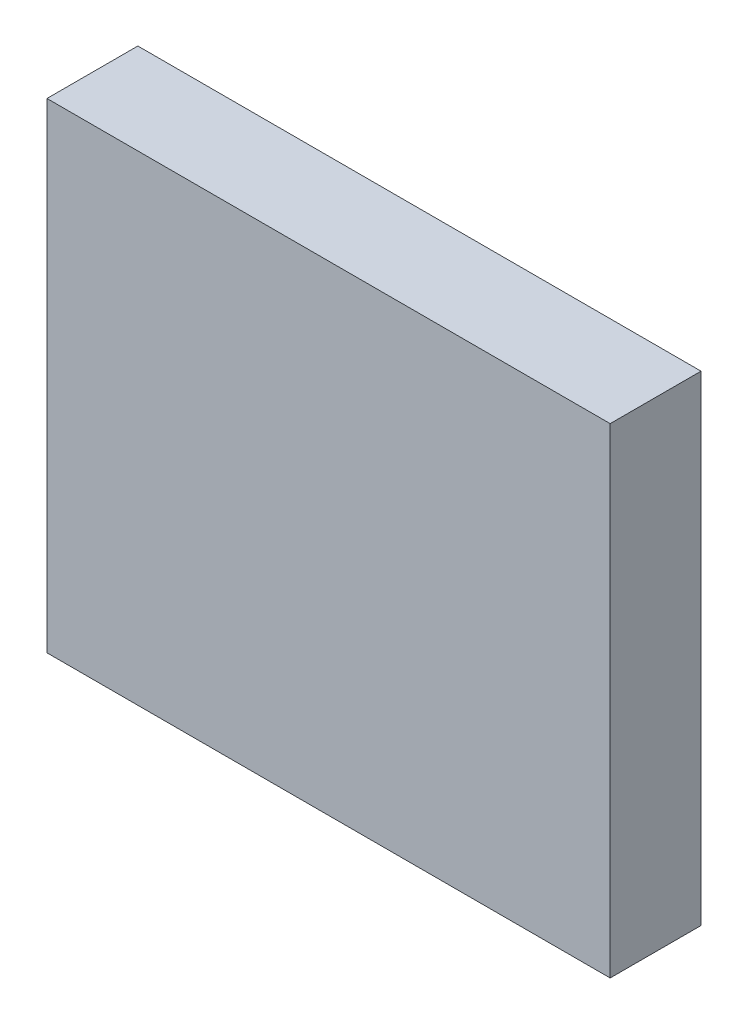
ISO-10303-21;
HEADER;
FILE_DESCRIPTION(('STEP AP214'),'2;1');
FILE_NAME('part.step','',(''),(''),'','','');
FILE_SCHEMA(('AUTOMOTIVE_DESIGN { 1 0 10303 214 1 1 1 1 }'));
ENDSEC;
DATA;
#1=APPLICATION_CONTEXT('core data for automotive mechanical design processes');
#2=APPLICATION_PROTOCOL_DEFINITION('international standard','automotive_design',2000,#1);
#3=PRODUCT_CONTEXT('',#1,'mechanical');
#4=PRODUCT('Part','Part','',(#3));
#5=PRODUCT_RELATED_PRODUCT_CATEGORY('part','',(#4));
#6=PRODUCT_DEFINITION_FORMATION('','',#4);
#7=PRODUCT_DEFINITION_CONTEXT('part definition',#1,'design');
#8=PRODUCT_DEFINITION('design','',#6,#7);
#9=PRODUCT_DEFINITION_SHAPE('','',#8);
#10=(LENGTH_UNIT() NAMED_UNIT(*) SI_UNIT(.MILLI.,.METRE.));
#11=(NAMED_UNIT(*) PLANE_ANGLE_UNIT() SI_UNIT($,.RADIAN.));
#12=(NAMED_UNIT(*) SI_UNIT($,.STERADIAN.) SOLID_ANGLE_UNIT());
#13=UNCERTAINTY_MEASURE_WITH_UNIT(LENGTH_MEASURE(1.E-05),#10,'distance_accuracy_value','');
#14=(GEOMETRIC_REPRESENTATION_CONTEXT(3) GLOBAL_UNCERTAINTY_ASSIGNED_CONTEXT((#13)) GLOBAL_UNIT_ASSIGNED_CONTEXT((#10,
#11,#12)) REPRESENTATION_CONTEXT('',''));
#15=CARTESIAN_POINT('',(0.,0.,0.));
#16=DIRECTION('',(0.,0.,1.));
#17=DIRECTION('',(1.,0.,0.));
#18=AXIS2_PLACEMENT_3D('',#15,#16,#17);
#19=CARTESIAN_POINT('',(-3.0988,-2.6416,1.));
#20=DIRECTION('',(1.,0.,0.));
#21=DIRECTION('',(0.,0.,-1.));
#22=AXIS2_PLACEMENT_3D('',#19,#20,#21);
#23=PLANE('',#22);
#24=DIRECTION('',(0.,-1.,0.));
#25=VECTOR('',#24,1.);
#26=CARTESIAN_POINT('',(-3.0988,-2.6416,0.));
#27=LINE('',#26,#25);
#28=CARTESIAN_POINT('',(-3.0988,2.6416,0.));
#29=VERTEX_POINT('',#28);
#30=CARTESIAN_POINT('',(-3.0988,-2.6416,0.));
#31=VERTEX_POINT('',#30);
#32=EDGE_CURVE('E96',#29,#31,#27,.T.);
#33=ORIENTED_EDGE('',*,*,#32,.T.);
#34=DIRECTION('',(0.,0.,-1.));
#35=VECTOR('',#34,1.);
#36=CARTESIAN_POINT('',(-3.0988,-2.6416,1.));
#37=LINE('',#36,#35);
#38=CARTESIAN_POINT('',(-3.0988,-2.6416,1.));
#39=VERTEX_POINT('',#38);
#40=EDGE_CURVE('E11',#39,#31,#37,.T.);
#41=ORIENTED_EDGE('',*,*,#40,.F.);
#42=DIRECTION('',(0.,-1.,0.));
#43=VECTOR('',#42,1.);
#44=CARTESIAN_POINT('',(-3.0988,-2.6416,1.));
#45=LINE('',#44,#43);
#46=CARTESIAN_POINT('',(-3.0988,2.6416,1.));
#47=VERTEX_POINT('',#46);
#48=EDGE_CURVE('E84',#47,#39,#45,.T.);
#49=ORIENTED_EDGE('',*,*,#48,.F.);
#50=DIRECTION('',(0.,0.,-1.));
#51=VECTOR('',#50,1.);
#52=CARTESIAN_POINT('',(-3.0988,2.6416,1.));
#53=LINE('',#52,#51);
#54=EDGE_CURVE('E92',#47,#29,#53,.T.);
#55=ORIENTED_EDGE('',*,*,#54,.T.);
#56=EDGE_LOOP('',(#33,#41,#49,#55));
#57=FACE_BOUND('',#56,.T.);
#58=ADVANCED_FACE('F33',(#57),#23,.F.);
#59=CARTESIAN_POINT('',(3.0988,-2.6416,1.));
#60=DIRECTION('',(0.,1.,0.));
#61=DIRECTION('',(0.,0.,1.));
#62=AXIS2_PLACEMENT_3D('',#59,#60,#61);
#63=PLANE('',#62);
#64=DIRECTION('',(1.,0.,0.));
#65=VECTOR('',#64,1.);
#66=CARTESIAN_POINT('',(3.0988,-2.6416,0.));
#67=LINE('',#66,#65);
#68=CARTESIAN_POINT('',(3.0988,-2.6416,0.));
#69=VERTEX_POINT('',#68);
#70=EDGE_CURVE('E88',#31,#69,#67,.T.);
#71=ORIENTED_EDGE('',*,*,#70,.T.);
#72=DIRECTION('',(0.,0.,-1.));
#73=VECTOR('',#72,1.);
#74=CARTESIAN_POINT('',(3.0988,-2.6416,1.));
#75=LINE('',#74,#73);
#76=CARTESIAN_POINT('',(3.0988,-2.6416,1.));
#77=VERTEX_POINT('',#76);
#78=EDGE_CURVE('E41',#77,#69,#75,.T.);
#79=ORIENTED_EDGE('',*,*,#78,.F.);
#80=DIRECTION('',(1.,0.,0.));
#81=VECTOR('',#80,1.);
#82=CARTESIAN_POINT('',(3.0988,-2.6416,1.));
#83=LINE('',#82,#81);
#84=EDGE_CURVE('E79',#39,#77,#83,.T.);
#85=ORIENTED_EDGE('',*,*,#84,.F.);
#86=ORIENTED_EDGE('',*,*,#40,.T.);
#87=EDGE_LOOP('',(#71,#79,#85,#86));
#88=FACE_BOUND('',#87,.T.);
#89=ADVANCED_FACE('F87',(#88),#63,.F.);
#90=CARTESIAN_POINT('',(3.0988,2.6416,1.));
#91=DIRECTION('',(-1.,0.,0.));
#92=DIRECTION('',(0.,0.,1.));
#93=AXIS2_PLACEMENT_3D('',#90,#91,#92);
#94=PLANE('',#93);
#95=DIRECTION('',(0.,1.,0.));
#96=VECTOR('',#95,1.);
#97=CARTESIAN_POINT('',(3.0988,2.6416,0.));
#98=LINE('',#97,#96);
#99=CARTESIAN_POINT('',(3.0988,2.6416,0.));
#100=VERTEX_POINT('',#99);
#101=EDGE_CURVE('E66',#69,#100,#98,.T.);
#102=ORIENTED_EDGE('',*,*,#101,.T.);
#103=DIRECTION('',(0.,0.,-1.));
#104=VECTOR('',#103,1.);
#105=CARTESIAN_POINT('',(3.0988,2.6416,1.));
#106=LINE('',#105,#104);
#107=CARTESIAN_POINT('',(3.0988,2.6416,1.));
#108=VERTEX_POINT('',#107);
#109=EDGE_CURVE('E89',#108,#100,#106,.T.);
#110=ORIENTED_EDGE('',*,*,#109,.F.);
#111=DIRECTION('',(0.,1.,0.));
#112=VECTOR('',#111,1.);
#113=CARTESIAN_POINT('',(3.0988,2.6416,1.));
#114=LINE('',#113,#112);
#115=EDGE_CURVE('E82',#77,#108,#114,.T.);
#116=ORIENTED_EDGE('',*,*,#115,.F.);
#117=ORIENTED_EDGE('',*,*,#78,.T.);
#118=EDGE_LOOP('',(#102,#110,#116,#117));
#119=FACE_BOUND('',#118,.T.);
#120=ADVANCED_FACE('F90',(#119),#94,.F.);
#121=CARTESIAN_POINT('',(-3.0988,2.6416,1.));
#122=DIRECTION('',(0.,-1.,0.));
#123=DIRECTION('',(0.,0.,-1.));
#124=AXIS2_PLACEMENT_3D('',#121,#122,#123);
#125=PLANE('',#124);
#126=DIRECTION('',(-1.,0.,0.));
#127=VECTOR('',#126,1.);
#128=CARTESIAN_POINT('',(-3.0988,2.6416,0.));
#129=LINE('',#128,#127);
#130=EDGE_CURVE('E72',#100,#29,#129,.T.);
#131=ORIENTED_EDGE('',*,*,#130,.T.);
#132=ORIENTED_EDGE('',*,*,#54,.F.);
#133=DIRECTION('',(-1.,0.,0.));
#134=VECTOR('',#133,1.);
#135=CARTESIAN_POINT('',(-3.0988,2.6416,1.));
#136=LINE('',#135,#134);
#137=EDGE_CURVE('E49',#108,#47,#136,.T.);
#138=ORIENTED_EDGE('',*,*,#137,.F.);
#139=ORIENTED_EDGE('',*,*,#109,.T.);
#140=EDGE_LOOP('',(#131,#132,#138,#139));
#141=FACE_BOUND('',#140,.T.);
#142=ADVANCED_FACE('F103',(#141),#125,.F.);
#143=CARTESIAN_POINT('',(0.,0.,1.));
#144=DIRECTION('',(0.,0.,-1.));
#145=DIRECTION('',(-1.,0.,0.));
#146=AXIS2_PLACEMENT_3D('',#143,#144,#145);
#147=PLANE('',#146);
#148=ORIENTED_EDGE('',*,*,#48,.T.);
#149=ORIENTED_EDGE('',*,*,#84,.T.);
#150=ORIENTED_EDGE('',*,*,#115,.T.);
#151=ORIENTED_EDGE('',*,*,#137,.T.);
#152=EDGE_LOOP('',(#148,#149,#150,#151));
#153=FACE_BOUND('',#152,.T.);
#154=ADVANCED_FACE('F80',(#153),#147,.F.);
#155=CARTESIAN_POINT('',(0.,0.,0.));
#156=DIRECTION('',(0.,0.,-1.));
#157=DIRECTION('',(-1.,0.,0.));
#158=AXIS2_PLACEMENT_3D('',#155,#156,#157);
#159=PLANE('',#158);
#160=ORIENTED_EDGE('',*,*,#32,.F.);
#161=ORIENTED_EDGE('',*,*,#130,.F.);
#162=ORIENTED_EDGE('',*,*,#101,.F.);
#163=ORIENTED_EDGE('',*,*,#70,.F.);
#164=EDGE_LOOP('',(#160,#161,#162,#163));
#165=FACE_BOUND('',#164,.T.);
#166=ADVANCED_FACE('F106',(#165),#159,.T.);
#167=CLOSED_SHELL('',(#58,#89,#120,#142,#154,#166));
#168=MANIFOLD_SOLID_BREP('B2',#167);
#169=ADVANCED_BREP_SHAPE_REPRESENTATION('',(#18,#168),#14);
#170=SHAPE_DEFINITION_REPRESENTATION(#9,#169);
ENDSEC;
END-ISO-10303-21;
